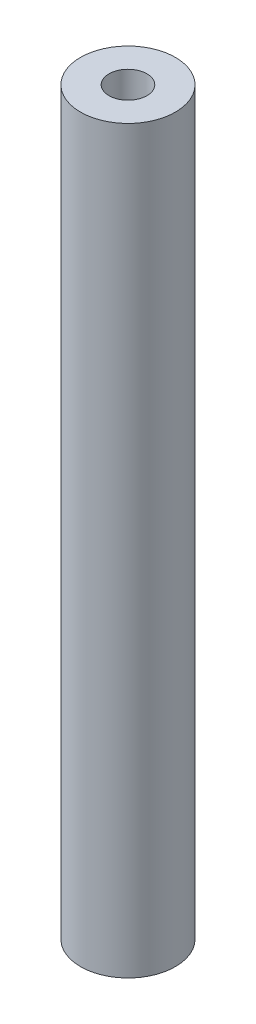
ISO-10303-21;
HEADER;
FILE_DESCRIPTION(('STEP AP214'),'2;1');
FILE_NAME('part.step','',(''),(''),'','','');
FILE_SCHEMA(('AUTOMOTIVE_DESIGN { 1 0 10303 214 1 1 1 1 }'));
ENDSEC;
DATA;
#1=APPLICATION_CONTEXT('core data for automotive mechanical design processes');
#2=APPLICATION_PROTOCOL_DEFINITION('international standard','automotive_design',2000,#1);
#3=PRODUCT_CONTEXT('',#1,'mechanical');
#4=PRODUCT('Part','Part','',(#3));
#5=PRODUCT_RELATED_PRODUCT_CATEGORY('part','',(#4));
#6=PRODUCT_DEFINITION_FORMATION('','',#4);
#7=PRODUCT_DEFINITION_CONTEXT('part definition',#1,'design');
#8=PRODUCT_DEFINITION('design','',#6,#7);
#9=PRODUCT_DEFINITION_SHAPE('','',#8);
#10=(LENGTH_UNIT() NAMED_UNIT(*) SI_UNIT(.MILLI.,.METRE.));
#11=(NAMED_UNIT(*) PLANE_ANGLE_UNIT() SI_UNIT($,.RADIAN.));
#12=(NAMED_UNIT(*) SI_UNIT($,.STERADIAN.) SOLID_ANGLE_UNIT());
#13=UNCERTAINTY_MEASURE_WITH_UNIT(LENGTH_MEASURE(1.E-05),#10,'distance_accuracy_value','');
#14=(GEOMETRIC_REPRESENTATION_CONTEXT(3) GLOBAL_UNCERTAINTY_ASSIGNED_CONTEXT((#13)) GLOBAL_UNIT_ASSIGNED_CONTEXT((#10,
#11,#12)) REPRESENTATION_CONTEXT('',''));
#15=CARTESIAN_POINT('',(0.,0.,0.));
#16=DIRECTION('',(0.,0.,1.));
#17=DIRECTION('',(1.,0.,0.));
#18=AXIS2_PLACEMENT_3D('',#15,#16,#17);
#19=CARTESIAN_POINT('',(0.,39.,0.));
#20=DIRECTION('',(0.,1.,0.));
#21=DIRECTION('',(0.,0.,1.));
#22=AXIS2_PLACEMENT_3D('',#19,#20,#21);
#23=PLANE('',#22);
#24=CARTESIAN_POINT('',(0.,39.,0.));
#25=DIRECTION('',(0.,1.,0.));
#26=DIRECTION('',(0.,0.,1.));
#27=AXIS2_PLACEMENT_3D('',#24,#25,#26);
#28=CIRCLE('',#27,2.5);
#29=CARTESIAN_POINT('',(0.,39.,2.5));
#30=VERTEX_POINT('',#29);
#31=EDGE_CURVE('E10',#30,#30,#28,.T.);
#32=ORIENTED_EDGE('',*,*,#31,.T.);
#33=EDGE_LOOP('',(#32));
#34=FACE_BOUND('',#33,.T.);
#35=CARTESIAN_POINT('',(0.,39.,0.));
#36=DIRECTION('',(0.,1.,0.));
#37=DIRECTION('',(0.,0.,1.));
#38=AXIS2_PLACEMENT_3D('',#35,#36,#37);
#39=CIRCLE('',#38,0.999999999999999);
#40=CARTESIAN_POINT('',(0.,39.,0.999999999999999));
#41=VERTEX_POINT('',#40);
#42=EDGE_CURVE('E42',#41,#41,#39,.T.);
#43=ORIENTED_EDGE('',*,*,#42,.F.);
#44=EDGE_LOOP('',(#43));
#45=FACE_BOUND('',#44,.T.);
#46=ADVANCED_FACE('F31',(#34,#45),#23,.T.);
#47=CARTESIAN_POINT('',(0.,0.,0.));
#48=DIRECTION('',(0.,1.,0.));
#49=DIRECTION('',(0.,0.,1.));
#50=AXIS2_PLACEMENT_3D('',#47,#48,#49);
#51=PLANE('',#50);
#52=CARTESIAN_POINT('',(0.,0.,0.));
#53=DIRECTION('',(0.,1.,0.));
#54=DIRECTION('',(0.,0.,1.));
#55=AXIS2_PLACEMENT_3D('',#52,#53,#54);
#56=CIRCLE('',#55,2.5);
#57=CARTESIAN_POINT('',(0.,0.,2.5));
#58=VERTEX_POINT('',#57);
#59=EDGE_CURVE('E35',#58,#58,#56,.T.);
#60=ORIENTED_EDGE('',*,*,#59,.F.);
#61=EDGE_LOOP('',(#60));
#62=FACE_BOUND('',#61,.T.);
#63=CARTESIAN_POINT('',(0.,0.,0.));
#64=DIRECTION('',(0.,1.,0.));
#65=DIRECTION('',(0.,0.,1.));
#66=AXIS2_PLACEMENT_3D('',#63,#64,#65);
#67=CIRCLE('',#66,0.999999999999999);
#68=CARTESIAN_POINT('',(0.,0.,0.999999999999999));
#69=VERTEX_POINT('',#68);
#70=EDGE_CURVE('E44',#69,#69,#67,.T.);
#71=ORIENTED_EDGE('',*,*,#70,.T.);
#72=EDGE_LOOP('',(#71));
#73=FACE_BOUND('',#72,.T.);
#74=ADVANCED_FACE('F54',(#62,#73),#51,.F.);
#75=CARTESIAN_POINT('',(0.,39.,0.));
#76=DIRECTION('',(0.,-1.,0.));
#77=DIRECTION('',(0.,0.,-1.));
#78=AXIS2_PLACEMENT_3D('',#75,#76,#77);
#79=CYLINDRICAL_SURFACE('',#78,2.5);
#80=ORIENTED_EDGE('',*,*,#31,.F.);
#81=EDGE_LOOP('',(#80));
#82=FACE_BOUND('',#81,.T.);
#83=ORIENTED_EDGE('',*,*,#59,.T.);
#84=EDGE_LOOP('',(#83));
#85=FACE_BOUND('',#84,.T.);
#86=ADVANCED_FACE('F33',(#82,#85),#79,.T.);
#87=CARTESIAN_POINT('',(0.,39.,0.));
#88=DIRECTION('',(0.,-1.,0.));
#89=DIRECTION('',(0.,0.,-1.));
#90=AXIS2_PLACEMENT_3D('',#87,#88,#89);
#91=CYLINDRICAL_SURFACE('',#90,0.999999999999999);
#92=ORIENTED_EDGE('',*,*,#42,.T.);
#93=EDGE_LOOP('',(#92));
#94=FACE_BOUND('',#93,.T.);
#95=ORIENTED_EDGE('',*,*,#70,.F.);
#96=EDGE_LOOP('',(#95));
#97=FACE_BOUND('',#96,.T.);
#98=ADVANCED_FACE('F50',(#94,#97),#91,.F.);
#99=CLOSED_SHELL('',(#46,#74,#86,#98));
#100=MANIFOLD_SOLID_BREP('B2',#99);
#101=ADVANCED_BREP_SHAPE_REPRESENTATION('',(#18,#100),#14);
#102=SHAPE_DEFINITION_REPRESENTATION(#9,#101);
ENDSEC;
END-ISO-10303-21;
